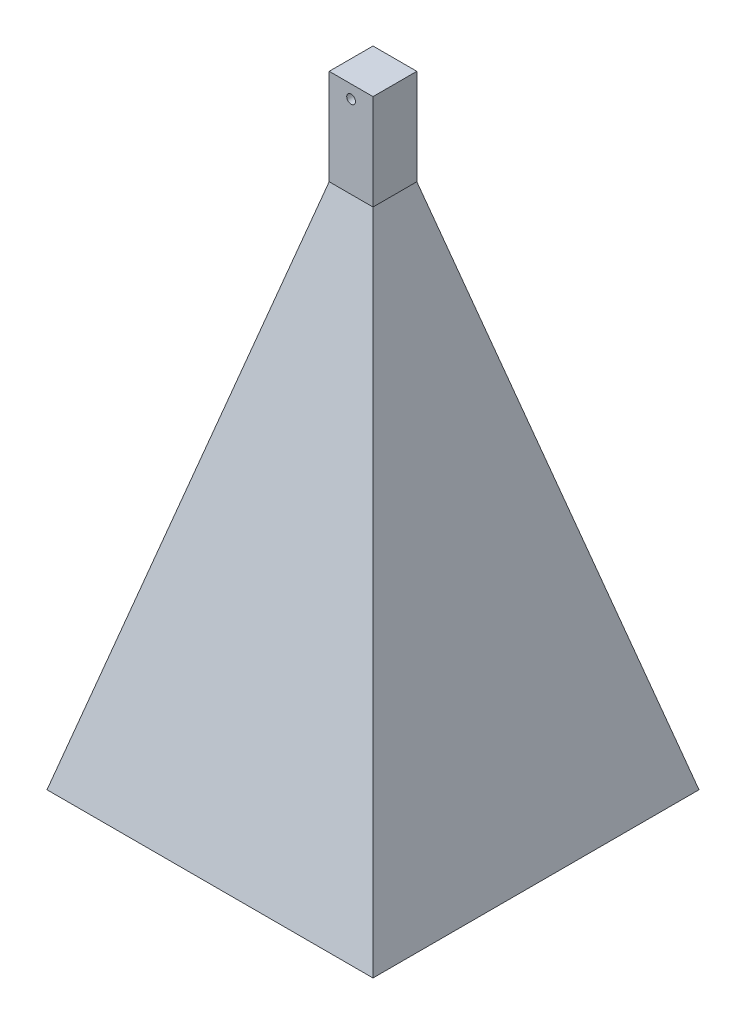
ISO-10303-21;
HEADER;
FILE_DESCRIPTION(('STEP AP214'),'2;1');
FILE_NAME('part.step','',(''),(''),'','','');
FILE_SCHEMA(('AUTOMOTIVE_DESIGN { 1 0 10303 214 1 1 1 1 }'));
ENDSEC;
DATA;
#1=APPLICATION_CONTEXT('core data for automotive mechanical design processes');
#2=APPLICATION_PROTOCOL_DEFINITION('international standard','automotive_design',2000,#1);
#3=PRODUCT_CONTEXT('',#1,'mechanical');
#4=PRODUCT('Part','Part','',(#3));
#5=PRODUCT_RELATED_PRODUCT_CATEGORY('part','',(#4));
#6=PRODUCT_DEFINITION_FORMATION('','',#4);
#7=PRODUCT_DEFINITION_CONTEXT('part definition',#1,'design');
#8=PRODUCT_DEFINITION('design','',#6,#7);
#9=PRODUCT_DEFINITION_SHAPE('','',#8);
#10=(LENGTH_UNIT() NAMED_UNIT(*) SI_UNIT(.MILLI.,.METRE.));
#11=(NAMED_UNIT(*) PLANE_ANGLE_UNIT() SI_UNIT($,.RADIAN.));
#12=(NAMED_UNIT(*) SI_UNIT($,.STERADIAN.) SOLID_ANGLE_UNIT());
#13=UNCERTAINTY_MEASURE_WITH_UNIT(LENGTH_MEASURE(1.E-05),#10,'distance_accuracy_value','');
#14=(GEOMETRIC_REPRESENTATION_CONTEXT(3) GLOBAL_UNCERTAINTY_ASSIGNED_CONTEXT((#13)) GLOBAL_UNIT_ASSIGNED_CONTEXT((#10,
#11,#12)) REPRESENTATION_CONTEXT('',''));
#15=CARTESIAN_POINT('',(0.,0.,0.));
#16=DIRECTION('',(0.,0.,1.));
#17=DIRECTION('',(1.,0.,0.));
#18=AXIS2_PLACEMENT_3D('',#15,#16,#17);
#19=CARTESIAN_POINT('',(5.,0.,-5.));
#20=DIRECTION('',(-0.965925826289068,0.258819045102521,0.));
#21=DIRECTION('',(-0.258819045102521,-0.965925826289068,0.));
#22=AXIS2_PLACEMENT_3D('',#19,#20,#21);
#23=PLANE('',#22);
#24=DIRECTION('',(0.,0.,-1.));
#25=VECTOR('',#24,1.);
#26=CARTESIAN_POINT('',(342.,1257.70112215071,-5.));
#27=LINE('',#26,#25);
#28=CARTESIAN_POINT('',(342.,1257.70112215071,-342.));
#29=VERTEX_POINT('',#28);
#30=CARTESIAN_POINT('',(342.,1257.70112215071,-402.));
#31=VERTEX_POINT('',#30);
#32=EDGE_CURVE('E153',#29,#31,#27,.T.);
#33=ORIENTED_EDGE('',*,*,#32,.F.);
#34=DIRECTION('',(-0.250562807085732,-0.935113126531029,0.250562807085732));
#35=VECTOR('',#34,1.);
#36=CARTESIAN_POINT('',(51.0817826962964,171.979554325926,-51.0817826962965));
#37=LINE('',#36,#35);
#38=CARTESIAN_POINT('',(5.,0.,-5.));
#39=VERTEX_POINT('',#38);
#40=EDGE_CURVE('E201',#29,#39,#37,.T.);
#41=ORIENTED_EDGE('',*,*,#40,.T.);
#42=DIRECTION('',(0.,0.,-1.));
#43=VECTOR('',#42,1.);
#44=CARTESIAN_POINT('',(5.,0.,-5.));
#45=LINE('',#44,#43);
#46=CARTESIAN_POINT('',(5.,0.,-739.));
#47=VERTEX_POINT('',#46);
#48=EDGE_CURVE('E184',#39,#47,#45,.T.);
#49=ORIENTED_EDGE('',*,*,#48,.T.);
#50=DIRECTION('',(-0.250562807085732,-0.935113126531029,-0.250562807085732));
#51=VECTOR('',#50,1.);
#52=CARTESIAN_POINT('',(51.0817826962965,171.979554325926,-692.918217303704));
#53=LINE('',#52,#51);
#54=EDGE_CURVE('E200',#31,#47,#53,.T.);
#55=ORIENTED_EDGE('',*,*,#54,.F.);
#56=EDGE_LOOP('',(#33,#41,#49,#55));
#57=FACE_BOUND('',#56,.T.);
#58=ADVANCED_FACE('F33',(#57),#23,.F.);
#59=CARTESIAN_POINT('',(739.,0.,-5.));
#60=DIRECTION('',(0.,0.258819045102521,0.965925826289068));
#61=DIRECTION('',(0.,-0.965925826289068,0.258819045102521));
#62=AXIS2_PLACEMENT_3D('',#59,#60,#61);
#63=PLANE('',#62);
#64=DIRECTION('',(-1.,0.,0.));
#65=VECTOR('',#64,1.);
#66=CARTESIAN_POINT('',(739.,1257.70112215071,-342.));
#67=LINE('',#66,#65);
#68=CARTESIAN_POINT('',(402.,1257.70112215071,-342.));
#69=VERTEX_POINT('',#68);
#70=EDGE_CURVE('E148',#69,#29,#67,.T.);
#71=ORIENTED_EDGE('',*,*,#70,.F.);
#72=DIRECTION('',(0.250562807085732,-0.935113126531029,0.250562807085732));
#73=VECTOR('',#72,1.);
#74=CARTESIAN_POINT('',(692.918217303704,171.979554325926,-51.0817826962964));
#75=LINE('',#74,#73);
#76=CARTESIAN_POINT('',(739.,0.,-5.));
#77=VERTEX_POINT('',#76);
#78=EDGE_CURVE('E204',#69,#77,#75,.T.);
#79=ORIENTED_EDGE('',*,*,#78,.T.);
#80=DIRECTION('',(-1.,0.,0.));
#81=VECTOR('',#80,1.);
#82=CARTESIAN_POINT('',(739.,0.,-5.));
#83=LINE('',#82,#81);
#84=EDGE_CURVE('E197',#77,#39,#83,.T.);
#85=ORIENTED_EDGE('',*,*,#84,.T.);
#86=ORIENTED_EDGE('',*,*,#40,.F.);
#87=EDGE_LOOP('',(#71,#79,#85,#86));
#88=FACE_BOUND('',#87,.T.);
#89=ADVANCED_FACE('F271',(#88),#63,.F.);
#90=CARTESIAN_POINT('',(739.,0.,-739.));
#91=DIRECTION('',(0.965925826289068,0.258819045102521,0.));
#92=DIRECTION('',(-0.258819045102521,0.965925826289068,0.));
#93=AXIS2_PLACEMENT_3D('',#90,#91,#92);
#94=PLANE('',#93);
#95=DIRECTION('',(0.,0.,1.));
#96=VECTOR('',#95,1.);
#97=CARTESIAN_POINT('',(402.,1257.70112215071,-739.));
#98=LINE('',#97,#96);
#99=CARTESIAN_POINT('',(402.,1257.70112215071,-402.));
#100=VERTEX_POINT('',#99);
#101=EDGE_CURVE('E143',#100,#69,#98,.T.);
#102=ORIENTED_EDGE('',*,*,#101,.F.);
#103=DIRECTION('',(0.250562807085732,-0.935113126531029,-0.250562807085732));
#104=VECTOR('',#103,1.);
#105=CARTESIAN_POINT('',(692.918217303704,171.979554325926,-692.918217303704));
#106=LINE('',#105,#104);
#107=CARTESIAN_POINT('',(739.,0.,-739.));
#108=VERTEX_POINT('',#107);
#109=EDGE_CURVE('E206',#100,#108,#106,.T.);
#110=ORIENTED_EDGE('',*,*,#109,.T.);
#111=DIRECTION('',(0.,0.,1.));
#112=VECTOR('',#111,1.);
#113=CARTESIAN_POINT('',(739.,0.,-739.));
#114=LINE('',#113,#112);
#115=EDGE_CURVE('E194',#108,#77,#114,.T.);
#116=ORIENTED_EDGE('',*,*,#115,.T.);
#117=ORIENTED_EDGE('',*,*,#78,.F.);
#118=EDGE_LOOP('',(#102,#110,#116,#117));
#119=FACE_BOUND('',#118,.T.);
#120=ADVANCED_FACE('F277',(#119),#94,.F.);
#121=CARTESIAN_POINT('',(5.,0.,-739.));
#122=DIRECTION('',(0.,0.258819045102521,-0.965925826289068));
#123=DIRECTION('',(0.,0.965925826289068,0.258819045102521));
#124=AXIS2_PLACEMENT_3D('',#121,#122,#123);
#125=PLANE('',#124);
#126=DIRECTION('',(1.,0.,0.));
#127=VECTOR('',#126,1.);
#128=CARTESIAN_POINT('',(5.00000000000465,1257.70112215071,-402.));
#129=LINE('',#128,#127);
#130=EDGE_CURVE('E11',#31,#100,#129,.T.);
#131=ORIENTED_EDGE('',*,*,#130,.F.);
#132=ORIENTED_EDGE('',*,*,#54,.T.);
#133=DIRECTION('',(1.,0.,0.));
#134=VECTOR('',#133,1.);
#135=CARTESIAN_POINT('',(5.,0.,-739.));
#136=LINE('',#135,#134);
#137=EDGE_CURVE('E191',#47,#108,#136,.T.);
#138=ORIENTED_EDGE('',*,*,#137,.T.);
#139=ORIENTED_EDGE('',*,*,#109,.F.);
#140=EDGE_LOOP('',(#131,#132,#138,#139));
#141=FACE_BOUND('',#140,.T.);
#142=ADVANCED_FACE('F282',(#141),#125,.F.);
#143=CARTESIAN_POINT('',(372.,1390.,-392.));
#144=DIRECTION('',(0.,0.,1.));
#145=DIRECTION('',(1.,0.,0.));
#146=AXIS2_PLACEMENT_3D('',#143,#144,#145);
#147=CYLINDRICAL_SURFACE('',#146,9.99999999999998);
#148=CARTESIAN_POINT('',(372.,1390.,-322.));
#149=DIRECTION('',(0.,0.,1.));
#150=DIRECTION('',(1.,0.,0.));
#151=AXIS2_PLACEMENT_3D('',#148,#149,#150);
#152=CIRCLE('',#151,9.99999999999998);
#153=CARTESIAN_POINT('',(382.,1390.,-322.));
#154=VERTEX_POINT('',#153);
#155=EDGE_CURVE('E156',#154,#154,#152,.T.);
#156=ORIENTED_EDGE('',*,*,#155,.T.);
#157=EDGE_LOOP('',(#156));
#158=FACE_BOUND('',#157,.T.);
#159=CARTESIAN_POINT('',(372.,1390.,-342.));
#160=DIRECTION('',(0.,0.,-1.));
#161=DIRECTION('',(-1.,0.,0.));
#162=AXIS2_PLACEMENT_3D('',#159,#160,#161);
#163=CIRCLE('',#162,9.99999999999998);
#164=CARTESIAN_POINT('',(362.,1390.,-342.));
#165=VERTEX_POINT('',#164);
#166=EDGE_CURVE('E144',#165,#165,#163,.F.);
#167=ORIENTED_EDGE('',*,*,#166,.F.);
#168=EDGE_LOOP('',(#167));
#169=FACE_BOUND('',#168,.T.);
#170=ADVANCED_FACE('F285',(#158,#169),#147,.F.);
#171=CARTESIAN_POINT('',(0.,0.,-744.));
#172=DIRECTION('',(0.,0.258819045102521,-0.965925826289068));
#173=DIRECTION('',(0.,0.965925826289068,0.258819045102521));
#174=AXIS2_PLACEMENT_3D('',#171,#172,#173);
#175=PLANE('',#174);
#176=DIRECTION('',(1.,0.,0.));
#177=VECTOR('',#176,1.);
#178=CARTESIAN_POINT('',(322.000000003115,1201.7203600372,-422.));
#179=LINE('',#178,#177);
#180=CARTESIAN_POINT('',(322.,1201.72036003709,-422.));
#181=VERTEX_POINT('',#180);
#182=CARTESIAN_POINT('',(421.999999999999,1201.72036003706,-422.));
#183=VERTEX_POINT('',#182);
#184=EDGE_CURVE('E175',#181,#183,#179,.T.);
#185=ORIENTED_EDGE('',*,*,#184,.T.);
#186=DIRECTION('',(-0.250562807085732,0.935113126531029,0.250562807085732));
#187=VECTOR('',#186,1.);
#188=CARTESIAN_POINT('',(697.290400100757,174.32260002519,-697.290400100757));
#189=LINE('',#188,#187);
#190=CARTESIAN_POINT('',(744.,0.,-744.));
#191=VERTEX_POINT('',#190);
#192=EDGE_CURVE('E220',#183,#191,#189,.F.);
#193=ORIENTED_EDGE('',*,*,#192,.T.);
#194=DIRECTION('',(1.,0.,0.));
#195=VECTOR('',#194,1.);
#196=CARTESIAN_POINT('',(0.,0.,-744.));
#197=LINE('',#196,#195);
#198=CARTESIAN_POINT('',(0.,0.,-744.));
#199=VERTEX_POINT('',#198);
#200=EDGE_CURVE('E203',#199,#191,#197,.T.);
#201=ORIENTED_EDGE('',*,*,#200,.F.);
#202=DIRECTION('',(-0.250562807085732,-0.935113126531029,-0.250562807085732));
#203=VECTOR('',#202,1.);
#204=CARTESIAN_POINT('',(46.7095998992433,174.32260002519,-697.290400100757));
#205=LINE('',#204,#203);
#206=EDGE_CURVE('E41',#181,#199,#205,.T.);
#207=ORIENTED_EDGE('',*,*,#206,.F.);
#208=EDGE_LOOP('',(#185,#193,#201,#207));
#209=FACE_BOUND('',#208,.T.);
#210=ADVANCED_FACE('F240',(#209),#175,.T.);
#211=CARTESIAN_POINT('',(0.,0.,0.));
#212=DIRECTION('',(-0.965925826289068,0.258819045102521,0.));
#213=DIRECTION('',(-0.258819045102521,-0.965925826289068,0.));
#214=AXIS2_PLACEMENT_3D('',#211,#212,#213);
#215=PLANE('',#214);
#216=DIRECTION('',(0.,0.,-1.));
#217=VECTOR('',#216,1.);
#218=CARTESIAN_POINT('',(322.,1201.7203600372,-322.));
#219=LINE('',#218,#217);
#220=CARTESIAN_POINT('',(322.,1201.72036003709,-322.));
#221=VERTEX_POINT('',#220);
#222=EDGE_CURVE('E171',#221,#181,#219,.T.);
#223=ORIENTED_EDGE('',*,*,#222,.T.);
#224=ORIENTED_EDGE('',*,*,#206,.T.);
#225=DIRECTION('',(0.,0.,-1.));
#226=VECTOR('',#225,1.);
#227=CARTESIAN_POINT('',(0.,0.,0.));
#228=LINE('',#227,#226);
#229=CARTESIAN_POINT('',(0.,0.,0.));
#230=VERTEX_POINT('',#229);
#231=EDGE_CURVE('E217',#230,#199,#228,.T.);
#232=ORIENTED_EDGE('',*,*,#231,.F.);
#233=DIRECTION('',(0.250562807085732,0.935113126531029,-0.250562807085732));
#234=VECTOR('',#233,1.);
#235=CARTESIAN_POINT('',(0.,0.,0.));
#236=LINE('',#235,#234);
#237=EDGE_CURVE('E222',#221,#230,#236,.F.);
#238=ORIENTED_EDGE('',*,*,#237,.F.);
#239=EDGE_LOOP('',(#223,#224,#232,#238));
#240=FACE_BOUND('',#239,.T.);
#241=ADVANCED_FACE('F35',(#240),#215,.T.);
#242=CARTESIAN_POINT('',(0.,0.,0.));
#243=DIRECTION('',(0.,0.258819045102521,0.965925826289068));
#244=DIRECTION('',(0.,-0.965925826289068,0.258819045102521));
#245=AXIS2_PLACEMENT_3D('',#242,#243,#244);
#246=PLANE('',#245);
#247=DIRECTION('',(0.250562807085732,-0.935113126531029,0.250562807085732));
#248=VECTOR('',#247,1.);
#249=CARTESIAN_POINT('',(744.,0.,0.));
#250=LINE('',#249,#248);
#251=CARTESIAN_POINT('',(422.,1201.72036003718,-322.));
#252=VERTEX_POINT('',#251);
#253=CARTESIAN_POINT('',(744.,0.,0.));
#254=VERTEX_POINT('',#253);
#255=EDGE_CURVE('E224',#252,#254,#250,.T.);
#256=ORIENTED_EDGE('',*,*,#255,.F.);
#257=DIRECTION('',(-1.,0.,0.));
#258=VECTOR('',#257,1.);
#259=CARTESIAN_POINT('',(322.,1201.7203600372,-322.));
#260=LINE('',#259,#258);
#261=EDGE_CURVE('E174',#221,#252,#260,.F.);
#262=ORIENTED_EDGE('',*,*,#261,.F.);
#263=ORIENTED_EDGE('',*,*,#237,.T.);
#264=DIRECTION('',(1.,0.,0.));
#265=VECTOR('',#264,1.);
#266=CARTESIAN_POINT('',(0.,0.,0.));
#267=LINE('',#266,#265);
#268=EDGE_CURVE('E214',#230,#254,#267,.T.);
#269=ORIENTED_EDGE('',*,*,#268,.T.);
#270=EDGE_LOOP('',(#256,#262,#263,#269));
#271=FACE_BOUND('',#270,.T.);
#272=ADVANCED_FACE('F231',(#271),#246,.T.);
#273=CARTESIAN_POINT('',(744.,0.,0.));
#274=DIRECTION('',(0.965925826289068,0.258819045102521,0.));
#275=DIRECTION('',(-0.258819045102521,0.965925826289068,0.));
#276=AXIS2_PLACEMENT_3D('',#273,#274,#275);
#277=PLANE('',#276);
#278=ORIENTED_EDGE('',*,*,#192,.F.);
#279=DIRECTION('',(0.,0.,1.));
#280=VECTOR('',#279,1.);
#281=CARTESIAN_POINT('',(422.,1201.7203600372,-322.));
#282=LINE('',#281,#280);
#283=EDGE_CURVE('E172',#252,#183,#282,.F.);
#284=ORIENTED_EDGE('',*,*,#283,.F.);
#285=ORIENTED_EDGE('',*,*,#255,.T.);
#286=DIRECTION('',(0.,0.,-1.));
#287=VECTOR('',#286,1.);
#288=CARTESIAN_POINT('',(744.,0.,0.));
#289=LINE('',#288,#287);
#290=EDGE_CURVE('E211',#254,#191,#289,.T.);
#291=ORIENTED_EDGE('',*,*,#290,.T.);
#292=EDGE_LOOP('',(#278,#284,#285,#291));
#293=FACE_BOUND('',#292,.T.);
#294=ADVANCED_FACE('F244',(#293),#277,.T.);
#295=CARTESIAN_POINT('',(0.,0.,0.));
#296=DIRECTION('',(0.,1.,0.));
#297=DIRECTION('',(0.,0.,1.));
#298=AXIS2_PLACEMENT_3D('',#295,#296,#297);
#299=PLANE('',#298);
#300=ORIENTED_EDGE('',*,*,#137,.F.);
#301=ORIENTED_EDGE('',*,*,#48,.F.);
#302=ORIENTED_EDGE('',*,*,#84,.F.);
#303=ORIENTED_EDGE('',*,*,#115,.F.);
#304=EDGE_LOOP('',(#300,#301,#302,#303));
#305=FACE_BOUND('',#304,.T.);
#306=ORIENTED_EDGE('',*,*,#200,.T.);
#307=ORIENTED_EDGE('',*,*,#290,.F.);
#308=ORIENTED_EDGE('',*,*,#268,.F.);
#309=ORIENTED_EDGE('',*,*,#231,.T.);
#310=EDGE_LOOP('',(#306,#307,#308,#309));
#311=FACE_BOUND('',#310,.T.);
#312=ADVANCED_FACE('F236',(#305,#311),#299,.F.);
#313=CARTESIAN_POINT('',(322.,-500000.,-422.));
#314=DIRECTION('',(0.,0.,-1.));
#315=DIRECTION('',(-1.,0.,0.));
#316=AXIS2_PLACEMENT_3D('',#313,#314,#315);
#317=PLANE('',#316);
#318=ORIENTED_EDGE('',*,*,#184,.F.);
#319=DIRECTION('',(0.,1.,0.));
#320=VECTOR('',#319,1.);
#321=CARTESIAN_POINT('',(322.,-500000.,-422.));
#322=LINE('',#321,#320);
#323=CARTESIAN_POINT('',(322.,1420.,-422.));
#324=VERTEX_POINT('',#323);
#325=EDGE_CURVE('E179',#181,#324,#322,.T.);
#326=ORIENTED_EDGE('',*,*,#325,.T.);
#327=DIRECTION('',(-1.,0.,0.));
#328=VECTOR('',#327,1.);
#329=CARTESIAN_POINT('',(322.,1420.,-422.));
#330=LINE('',#329,#328);
#331=CARTESIAN_POINT('',(422.,1420.,-422.));
#332=VERTEX_POINT('',#331);
#333=EDGE_CURVE('E162',#332,#324,#330,.T.);
#334=ORIENTED_EDGE('',*,*,#333,.F.);
#335=DIRECTION('',(0.,1.,0.));
#336=VECTOR('',#335,1.);
#337=CARTESIAN_POINT('',(422.,-500000.,-422.));
#338=LINE('',#337,#336);
#339=EDGE_CURVE('E177',#183,#332,#338,.T.);
#340=ORIENTED_EDGE('',*,*,#339,.F.);
#341=EDGE_LOOP('',(#318,#326,#334,#340));
#342=FACE_BOUND('',#341,.T.);
#343=ADVANCED_FACE('F249',(#342),#317,.T.);
#344=CARTESIAN_POINT('',(422.,-500000.,-322.));
#345=DIRECTION('',(1.,0.,0.));
#346=DIRECTION('',(0.,0.,-1.));
#347=AXIS2_PLACEMENT_3D('',#344,#345,#346);
#348=PLANE('',#347);
#349=DIRECTION('',(0.,1.,0.));
#350=VECTOR('',#349,1.);
#351=CARTESIAN_POINT('',(422.,-500000.,-322.));
#352=LINE('',#351,#350);
#353=CARTESIAN_POINT('',(422.,1420.,-322.));
#354=VERTEX_POINT('',#353);
#355=EDGE_CURVE('E55',#252,#354,#352,.T.);
#356=ORIENTED_EDGE('',*,*,#355,.F.);
#357=ORIENTED_EDGE('',*,*,#283,.T.);
#358=ORIENTED_EDGE('',*,*,#339,.T.);
#359=DIRECTION('',(0.,0.,-1.));
#360=VECTOR('',#359,1.);
#361=CARTESIAN_POINT('',(422.,1420.,-322.));
#362=LINE('',#361,#360);
#363=EDGE_CURVE('E159',#354,#332,#362,.T.);
#364=ORIENTED_EDGE('',*,*,#363,.F.);
#365=EDGE_LOOP('',(#356,#357,#358,#364));
#366=FACE_BOUND('',#365,.T.);
#367=ADVANCED_FACE('F246',(#366),#348,.T.);
#368=CARTESIAN_POINT('',(322.,-500000.,-322.));
#369=DIRECTION('',(-1.,0.,0.));
#370=DIRECTION('',(0.,0.,1.));
#371=AXIS2_PLACEMENT_3D('',#368,#369,#370);
#372=PLANE('',#371);
#373=ORIENTED_EDGE('',*,*,#222,.F.);
#374=DIRECTION('',(0.,1.,0.));
#375=VECTOR('',#374,1.);
#376=CARTESIAN_POINT('',(322.,-500000.,-322.));
#377=LINE('',#376,#375);
#378=CARTESIAN_POINT('',(322.,1420.,-322.));
#379=VERTEX_POINT('',#378);
#380=EDGE_CURVE('E181',#221,#379,#377,.T.);
#381=ORIENTED_EDGE('',*,*,#380,.T.);
#382=DIRECTION('',(0.,0.,1.));
#383=VECTOR('',#382,1.);
#384=CARTESIAN_POINT('',(322.,1420.,-322.));
#385=LINE('',#384,#383);
#386=EDGE_CURVE('E165',#324,#379,#385,.T.);
#387=ORIENTED_EDGE('',*,*,#386,.F.);
#388=ORIENTED_EDGE('',*,*,#325,.F.);
#389=EDGE_LOOP('',(#373,#381,#387,#388));
#390=FACE_BOUND('',#389,.T.);
#391=ADVANCED_FACE('F259',(#390),#372,.T.);
#392=CARTESIAN_POINT('',(322.,-500000.,-322.));
#393=DIRECTION('',(0.,0.,1.));
#394=DIRECTION('',(1.,0.,0.));
#395=AXIS2_PLACEMENT_3D('',#392,#393,#394);
#396=PLANE('',#395);
#397=ORIENTED_EDGE('',*,*,#155,.F.);
#398=EDGE_LOOP('',(#397));
#399=FACE_BOUND('',#398,.T.);
#400=ORIENTED_EDGE('',*,*,#380,.F.);
#401=ORIENTED_EDGE('',*,*,#261,.T.);
#402=ORIENTED_EDGE('',*,*,#355,.T.);
#403=DIRECTION('',(1.,0.,0.));
#404=VECTOR('',#403,1.);
#405=CARTESIAN_POINT('',(322.,1420.,-322.));
#406=LINE('',#405,#404);
#407=EDGE_CURVE('E168',#379,#354,#406,.T.);
#408=ORIENTED_EDGE('',*,*,#407,.F.);
#409=EDGE_LOOP('',(#400,#401,#402,#408));
#410=FACE_BOUND('',#409,.T.);
#411=ADVANCED_FACE('F257',(#399,#410),#396,.T.);
#412=CARTESIAN_POINT('',(0.,1420.,0.));
#413=DIRECTION('',(0.,-1.,0.));
#414=DIRECTION('',(0.,0.,-1.));
#415=AXIS2_PLACEMENT_3D('',#412,#413,#414);
#416=PLANE('',#415);
#417=ORIENTED_EDGE('',*,*,#363,.T.);
#418=ORIENTED_EDGE('',*,*,#333,.T.);
#419=ORIENTED_EDGE('',*,*,#386,.T.);
#420=ORIENTED_EDGE('',*,*,#407,.T.);
#421=EDGE_LOOP('',(#417,#418,#419,#420));
#422=FACE_BOUND('',#421,.T.);
#423=ADVANCED_FACE('F253',(#422),#416,.F.);
#424=CARTESIAN_POINT('',(402.,1410.,-342.));
#425=DIRECTION('',(-1.,0.,0.));
#426=DIRECTION('',(0.,0.,1.));
#427=AXIS2_PLACEMENT_3D('',#424,#425,#426);
#428=PLANE('',#427);
#429=ORIENTED_EDGE('',*,*,#101,.T.);
#430=DIRECTION('',(0.,-1.,0.));
#431=VECTOR('',#430,1.);
#432=CARTESIAN_POINT('',(402.,1410.,-342.));
#433=LINE('',#432,#431);
#434=CARTESIAN_POINT('',(402.,1410.,-342.));
#435=VERTEX_POINT('',#434);
#436=EDGE_CURVE('E136',#435,#69,#433,.T.);
#437=ORIENTED_EDGE('',*,*,#436,.F.);
#438=DIRECTION('',(0.,0.,-1.));
#439=VECTOR('',#438,1.);
#440=CARTESIAN_POINT('',(402.,1410.,-342.));
#441=LINE('',#440,#439);
#442=CARTESIAN_POINT('',(402.,1410.,-402.));
#443=VERTEX_POINT('',#442);
#444=EDGE_CURVE('E121',#435,#443,#441,.T.);
#445=ORIENTED_EDGE('',*,*,#444,.T.);
#446=DIRECTION('',(0.,-1.,0.));
#447=VECTOR('',#446,1.);
#448=CARTESIAN_POINT('',(402.,1410.,-402.));
#449=LINE('',#448,#447);
#450=EDGE_CURVE('E145',#443,#100,#449,.T.);
#451=ORIENTED_EDGE('',*,*,#450,.T.);
#452=EDGE_LOOP('',(#429,#437,#445,#451));
#453=FACE_BOUND('',#452,.T.);
#454=ADVANCED_FACE('F141',(#453),#428,.T.);
#455=CARTESIAN_POINT('',(402.,1410.,-402.));
#456=DIRECTION('',(0.,0.,1.));
#457=DIRECTION('',(1.,0.,0.));
#458=AXIS2_PLACEMENT_3D('',#455,#456,#457);
#459=PLANE('',#458);
#460=ORIENTED_EDGE('',*,*,#130,.T.);
#461=ORIENTED_EDGE('',*,*,#450,.F.);
#462=DIRECTION('',(-1.,0.,0.));
#463=VECTOR('',#462,1.);
#464=CARTESIAN_POINT('',(402.,1410.,-402.));
#465=LINE('',#464,#463);
#466=CARTESIAN_POINT('',(342.,1410.,-402.));
#467=VERTEX_POINT('',#466);
#468=EDGE_CURVE('E126',#443,#467,#465,.T.);
#469=ORIENTED_EDGE('',*,*,#468,.T.);
#470=DIRECTION('',(0.,-1.,0.));
#471=VECTOR('',#470,1.);
#472=CARTESIAN_POINT('',(342.,1410.,-402.));
#473=LINE('',#472,#471);
#474=EDGE_CURVE('E47',#467,#31,#473,.T.);
#475=ORIENTED_EDGE('',*,*,#474,.T.);
#476=EDGE_LOOP('',(#460,#461,#469,#475));
#477=FACE_BOUND('',#476,.T.);
#478=ADVANCED_FACE('F393',(#477),#459,.T.);
#479=CARTESIAN_POINT('',(342.,1410.,-402.));
#480=DIRECTION('',(1.,0.,0.));
#481=DIRECTION('',(0.,0.,-1.));
#482=AXIS2_PLACEMENT_3D('',#479,#480,#481);
#483=PLANE('',#482);
#484=ORIENTED_EDGE('',*,*,#32,.T.);
#485=ORIENTED_EDGE('',*,*,#474,.F.);
#486=DIRECTION('',(0.,0.,1.));
#487=VECTOR('',#486,1.);
#488=CARTESIAN_POINT('',(342.,1410.,-402.));
#489=LINE('',#488,#487);
#490=CARTESIAN_POINT('',(342.,1410.,-342.));
#491=VERTEX_POINT('',#490);
#492=EDGE_CURVE('E437',#467,#491,#489,.T.);
#493=ORIENTED_EDGE('',*,*,#492,.T.);
#494=DIRECTION('',(0.,-1.,0.));
#495=VECTOR('',#494,1.);
#496=CARTESIAN_POINT('',(342.,1410.,-342.));
#497=LINE('',#496,#495);
#498=EDGE_CURVE('E139',#491,#29,#497,.T.);
#499=ORIENTED_EDGE('',*,*,#498,.T.);
#500=EDGE_LOOP('',(#484,#485,#493,#499));
#501=FACE_BOUND('',#500,.T.);
#502=ADVANCED_FACE('F390',(#501),#483,.T.);
#503=CARTESIAN_POINT('',(342.,1410.,-342.));
#504=DIRECTION('',(0.,0.,-1.));
#505=DIRECTION('',(-1.,0.,0.));
#506=AXIS2_PLACEMENT_3D('',#503,#504,#505);
#507=PLANE('',#506);
#508=ORIENTED_EDGE('',*,*,#166,.T.);
#509=EDGE_LOOP('',(#508));
#510=FACE_BOUND('',#509,.T.);
#511=ORIENTED_EDGE('',*,*,#70,.T.);
#512=ORIENTED_EDGE('',*,*,#498,.F.);
#513=DIRECTION('',(1.,0.,0.));
#514=VECTOR('',#513,1.);
#515=CARTESIAN_POINT('',(342.,1410.,-342.));
#516=LINE('',#515,#514);
#517=EDGE_CURVE('E125',#491,#435,#516,.T.);
#518=ORIENTED_EDGE('',*,*,#517,.T.);
#519=ORIENTED_EDGE('',*,*,#436,.T.);
#520=EDGE_LOOP('',(#511,#512,#518,#519));
#521=FACE_BOUND('',#520,.T.);
#522=ADVANCED_FACE('F135',(#510,#521),#507,.T.);
#523=CARTESIAN_POINT('',(0.,1410.,0.));
#524=DIRECTION('',(0.,1.,0.));
#525=DIRECTION('',(0.,0.,1.));
#526=AXIS2_PLACEMENT_3D('',#523,#524,#525);
#527=PLANE('',#526);
#528=ORIENTED_EDGE('',*,*,#517,.F.);
#529=ORIENTED_EDGE('',*,*,#492,.F.);
#530=ORIENTED_EDGE('',*,*,#468,.F.);
#531=ORIENTED_EDGE('',*,*,#444,.F.);
#532=EDGE_LOOP('',(#528,#529,#530,#531));
#533=FACE_BOUND('',#532,.T.);
#534=ADVANCED_FACE('F123',(#533),#527,.F.);
#535=CLOSED_SHELL('',(#58,#89,#120,#142,#170,#210,#241,#272,#294,#312,#343,#367,#391,#411,#423,
#454,#478,#502,#522,#534));
#536=MANIFOLD_SOLID_BREP('B2',#535);
#537=ADVANCED_BREP_SHAPE_REPRESENTATION('',(#18,#536),#14);
#538=SHAPE_DEFINITION_REPRESENTATION(#9,#537);
ENDSEC;
END-ISO-10303-21;
